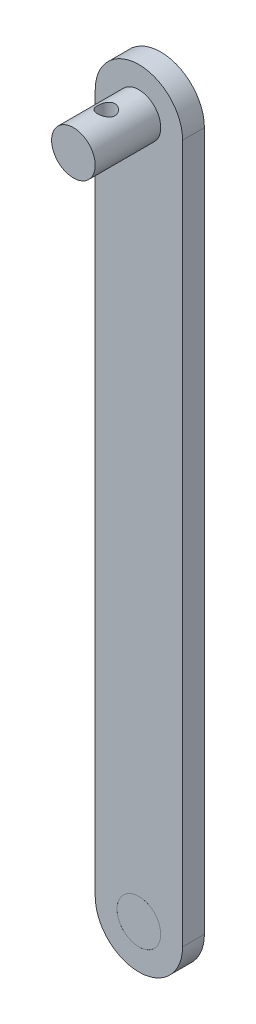
ISO-10303-21;
HEADER;
FILE_DESCRIPTION(('STEP AP214'),'2;1');
FILE_NAME('part.step','',(''),(''),'','','');
FILE_SCHEMA(('AUTOMOTIVE_DESIGN { 1 0 10303 214 1 1 1 1 }'));
ENDSEC;
DATA;
#1=APPLICATION_CONTEXT('core data for automotive mechanical design processes');
#2=APPLICATION_PROTOCOL_DEFINITION('international standard','automotive_design',2000,#1);
#3=PRODUCT_CONTEXT('',#1,'mechanical');
#4=PRODUCT('Part','Part','',(#3));
#5=PRODUCT_RELATED_PRODUCT_CATEGORY('part','',(#4));
#6=PRODUCT_DEFINITION_FORMATION('','',#4);
#7=PRODUCT_DEFINITION_CONTEXT('part definition',#1,'design');
#8=PRODUCT_DEFINITION('design','',#6,#7);
#9=PRODUCT_DEFINITION_SHAPE('','',#8);
#10=(LENGTH_UNIT() NAMED_UNIT(*) SI_UNIT(.MILLI.,.METRE.));
#11=(NAMED_UNIT(*) PLANE_ANGLE_UNIT() SI_UNIT($,.RADIAN.));
#12=(NAMED_UNIT(*) SI_UNIT($,.STERADIAN.) SOLID_ANGLE_UNIT());
#13=UNCERTAINTY_MEASURE_WITH_UNIT(LENGTH_MEASURE(1.E-05),#10,'distance_accuracy_value','');
#14=(GEOMETRIC_REPRESENTATION_CONTEXT(3) GLOBAL_UNCERTAINTY_ASSIGNED_CONTEXT((#13)) GLOBAL_UNIT_ASSIGNED_CONTEXT((#10,
#11,#12)) REPRESENTATION_CONTEXT('',''));
#15=CARTESIAN_POINT('',(0.,0.,0.));
#16=DIRECTION('',(0.,0.,1.));
#17=DIRECTION('',(1.,0.,0.));
#18=AXIS2_PLACEMENT_3D('',#15,#16,#17);
#19=CARTESIAN_POINT('',(0.,-101.6,-6.35));
#20=DIRECTION('',(0.,0.,1.));
#21=DIRECTION('',(1.,0.,0.));
#22=AXIS2_PLACEMENT_3D('',#19,#20,#21);
#23=CYLINDRICAL_SURFACE('',#22,6.35);
#24=CARTESIAN_POINT('',(0.,-101.6,-6.35));
#25=DIRECTION('',(0.,0.,1.));
#26=DIRECTION('',(1.,0.,0.));
#27=AXIS2_PLACEMENT_3D('',#24,#25,#26);
#28=CIRCLE('',#27,6.35);
#29=CARTESIAN_POINT('',(6.35,-101.6,-6.35));
#30=VERTEX_POINT('',#29);
#31=EDGE_CURVE('E11',#30,#30,#28,.T.);
#32=ORIENTED_EDGE('',*,*,#31,.T.);
#33=EDGE_LOOP('',(#32));
#34=FACE_BOUND('',#33,.T.);
#35=CARTESIAN_POINT('',(0.,-101.6,6.35));
#36=DIRECTION('',(0.,0.,1.));
#37=DIRECTION('',(1.,0.,0.));
#38=AXIS2_PLACEMENT_3D('',#35,#36,#37);
#39=CIRCLE('',#38,6.35);
#40=CARTESIAN_POINT('',(6.35,-101.6,6.35));
#41=VERTEX_POINT('',#40);
#42=EDGE_CURVE('E54',#41,#41,#39,.T.);
#43=ORIENTED_EDGE('',*,*,#42,.F.);
#44=EDGE_LOOP('',(#43));
#45=FACE_BOUND('',#44,.T.);
#46=ADVANCED_FACE('F51',(#34,#45),#23,.T.);
#47=CARTESIAN_POINT('',(0.,-101.6,-6.35));
#48=DIRECTION('',(0.,0.,1.));
#49=DIRECTION('',(1.,0.,0.));
#50=AXIS2_PLACEMENT_3D('',#47,#48,#49);
#51=PLANE('',#50);
#52=ORIENTED_EDGE('',*,*,#31,.F.);
#53=EDGE_LOOP('',(#52));
#54=FACE_BOUND('',#53,.T.);
#55=ADVANCED_FACE('F66',(#54),#51,.F.);
#56=CARTESIAN_POINT('',(0.,-101.6,6.35));
#57=DIRECTION('',(0.,0.,1.));
#58=DIRECTION('',(1.,0.,0.));
#59=AXIS2_PLACEMENT_3D('',#56,#57,#58);
#60=PLANE('',#59);
#61=ORIENTED_EDGE('',*,*,#42,.T.);
#62=EDGE_LOOP('',(#61));
#63=FACE_BOUND('',#62,.T.);
#64=ADVANCED_FACE('F63',(#63),#60,.T.);
#65=CLOSED_SHELL('',(#46,#55,#64));
#66=MANIFOLD_SOLID_BREP('B2',#65);
#67=CARTESIAN_POINT('',(0.,101.6,25.4));
#68=DIRECTION('',(0.,0.,-1.));
#69=DIRECTION('',(-1.,0.,0.));
#70=AXIS2_PLACEMENT_3D('',#67,#68,#69);
#71=CYLINDRICAL_SURFACE('',#70,6.35);
#72=CARTESIAN_POINT('',(0.,101.6,25.4));
#73=DIRECTION('',(0.,0.,1.));
#74=DIRECTION('',(1.,0.,0.));
#75=AXIS2_PLACEMENT_3D('',#72,#73,#74);
#76=CIRCLE('',#75,6.35);
#77=CARTESIAN_POINT('',(6.35,101.6,25.4));
#78=VERTEX_POINT('',#77);
#79=EDGE_CURVE('E223',#78,#78,#76,.T.);
#80=ORIENTED_EDGE('',*,*,#79,.F.);
#81=EDGE_LOOP('',(#80));
#82=FACE_BOUND('',#81,.T.);
#83=CARTESIAN_POINT('',(0.,101.6,6.35));
#84=DIRECTION('',(0.,0.,1.));
#85=DIRECTION('',(1.,0.,0.));
#86=AXIS2_PLACEMENT_3D('',#83,#84,#85);
#87=CIRCLE('',#86,6.35);
#88=CARTESIAN_POINT('',(6.35,101.6,6.35));
#89=VERTEX_POINT('',#88);
#90=EDGE_CURVE('E180',#89,#89,#87,.T.);
#91=ORIENTED_EDGE('',*,*,#90,.T.);
#92=EDGE_LOOP('',(#91));
#93=FACE_BOUND('',#92,.T.);
#94=CARTESIAN_POINT('',(0.,95.25,13.335));
#95=CARTESIAN_POINT('',(0.136524206735944,95.2500067537653,13.3350090967706));
#96=CARTESIAN_POINT('',(0.273271326569832,95.2544532912096,13.3460706290327));
#97=CARTESIAN_POINT('',(0.542918354048302,95.2718008185411,13.3899255020854));
#98=CARTESIAN_POINT('',(0.67580677525382,95.2847247905756,13.4227779202305));
#99=CARTESIAN_POINT('',(0.933392062216559,95.3176373635284,13.5088323741441));
#100=CARTESIAN_POINT('',(1.05811419595267,95.3376028200288,13.5619677889683));
#101=CARTESIAN_POINT('',(1.29676124667188,95.3826310910206,13.6868144158289));
#102=CARTESIAN_POINT('',(1.41068989295145,95.407692135432,13.7585191796974));
#103=CARTESIAN_POINT('',(1.63004632396242,95.4616977319217,13.9220390644513));
#104=CARTESIAN_POINT('',(1.7348990980416,95.4907628253185,14.0145854484005));
#105=CARTESIAN_POINT('',(1.92808224416796,95.5489506769739,14.2156180094426));
#106=CARTESIAN_POINT('',(2.01640453280471,95.5780734564433,14.3241119388329));
#107=CARTESIAN_POINT('',(2.17789070386169,95.6345205431251,14.5598236477725));
#108=CARTESIAN_POINT('',(2.25020502702758,95.6617071269639,14.6876598368656));
#109=CARTESIAN_POINT('',(2.37204849226828,95.7093126810088,14.9549312263771));
#110=CARTESIAN_POINT('',(2.42158845640477,95.7297348642726,15.094360880468));
#111=CARTESIAN_POINT('',(2.49415150594019,95.7602052576373,15.374254663566));
#112=CARTESIAN_POINT('',(2.51827533663395,95.770681961465,15.5143850691561));
#113=CARTESIAN_POINT('',(2.54275966122209,95.7813171485947,15.7970664478759));
#114=CARTESIAN_POINT('',(2.54313184070206,95.7814807058657,15.9396161961804));
#115=CARTESIAN_POINT('',(2.52093649674541,95.7718366464395,16.2125109727455));
#116=CARTESIAN_POINT('',(2.49996364917145,95.7627221770105,16.3430149572978));
#117=CARTESIAN_POINT('',(2.4383325379743,95.7367124173817,16.5984676361302));
#118=CARTESIAN_POINT('',(2.39767083940082,95.7198157695151,16.7234153569005));
#119=CARTESIAN_POINT('',(2.29704231034095,95.6797745393753,16.9672226519685));
#120=CARTESIAN_POINT('',(2.23669842514074,95.6565094831339,17.0859059335993));
#121=CARTESIAN_POINT('',(2.09868320512962,95.6063859218485,17.3118980867793));
#122=CARTESIAN_POINT('',(2.02100536247799,95.579526068698,17.4192026639416));
#123=CARTESIAN_POINT('',(1.84346926130722,95.5227104433731,17.6281203555785));
#124=CARTESIAN_POINT('',(1.74236057797273,95.4926758548029,17.7286522863964));
#125=CARTESIAN_POINT('',(1.52439932283632,95.4346602230298,17.9116792870626));
#126=CARTESIAN_POINT('',(1.40754362297472,95.4066795895444,17.9941707647111));
#127=CARTESIAN_POINT('',(1.15833861880942,95.3552235479402,18.1401941582181));
#128=CARTESIAN_POINT('',(1.02572882401002,95.3318480697882,18.2033192971203));
#129=CARTESIAN_POINT('',(0.750600182163255,95.2929916802248,18.3059931835691));
#130=CARTESIAN_POINT('',(0.608086409999082,95.2775067590277,18.3455539076979));
#131=CARTESIAN_POINT('',(0.326257777261934,95.2569070282622,18.397789335183));
#132=CARTESIAN_POINT('',(0.187252983361636,95.2512325879144,18.411917016902));
#133=CARTESIAN_POINT('',(-0.091243543455936,95.249130322915,18.4171756376713));
#134=CARTESIAN_POINT('',(-0.23073514079441,95.2527001015049,18.4083125375653));
#135=CARTESIAN_POINT('',(-0.499659578684899,95.2683188982903,18.368909474259));
#136=CARTESIAN_POINT('',(-0.62926276455476,95.2799797299119,18.3393613649543));
#137=CARTESIAN_POINT('',(-0.881551993637283,95.3102050941501,18.2607766504465));
#138=CARTESIAN_POINT('',(-1.0042371459859,95.3287705135721,18.2117375418208));
#139=CARTESIAN_POINT('',(-1.24343005798686,95.3717092464107,18.0939631266065));
#140=CARTESIAN_POINT('',(-1.35963408889802,95.3962428370565,18.0246712505051));
#141=CARTESIAN_POINT('',(-1.57917336088447,95.4484582677318,17.8689757886399));
#142=CARTESIAN_POINT('',(-1.68250341777165,95.4761413674995,17.7825653454885));
#143=CARTESIAN_POINT('',(-1.88051826464125,95.5339070059961,17.5883950835537));
#144=CARTESIAN_POINT('',(-1.97418189591311,95.5640272939023,17.4796024022862));
#145=CARTESIAN_POINT('',(-2.14217402073601,95.621580753952,17.2473110945791));
#146=CARTESIAN_POINT('',(-2.21649932797567,95.6490134828117,17.1238100495719));
#147=CARTESIAN_POINT('',(-2.34417552737538,95.6981283911737,16.8637436478619));
#148=CARTESIAN_POINT('',(-2.39731625476711,95.7197522877693,16.7270633209867));
#149=CARTESIAN_POINT('',(-2.47941619931716,95.7538893468242,16.4455682623354));
#150=CARTESIAN_POINT('',(-2.50839326377964,95.7664092326381,16.3007596186691));
#151=CARTESIAN_POINT('',(-2.53963883293423,95.7799486569121,16.0183475646992));
#152=CARTESIAN_POINT('',(-2.54367929088355,95.7817309532725,15.8809755535463));
#153=CARTESIAN_POINT('',(-2.52959001592309,95.7755915823034,15.6076080308743));
#154=CARTESIAN_POINT('',(-2.51146309820303,95.7676711471913,15.4716123467771));
#155=CARTESIAN_POINT('',(-2.45500062199855,95.743691556969,15.2103681182758));
#156=CARTESIAN_POINT('',(-2.41749256915668,95.7279666367898,15.0849072492419));
#157=CARTESIAN_POINT('',(-2.32410696727523,95.6903851833461,14.8420091426196));
#158=CARTESIAN_POINT('',(-2.26822434513928,95.6685269569613,14.7245741317449));
#159=CARTESIAN_POINT('',(-2.13597822075728,95.6195876619585,14.4937357747428));
#160=CARTESIAN_POINT('',(-2.05862525564912,95.5922792096984,14.3809482552866));
#161=CARTESIAN_POINT('',(-1.88708371169555,95.5362096693914,14.1693985208091));
#162=CARTESIAN_POINT('',(-1.79289005847571,95.5074481453894,14.0706405492603));
#163=CARTESIAN_POINT('',(-1.58305912509117,95.4494717580423,13.8833822423316));
#164=CARTESIAN_POINT('',(-1.46642749471675,95.4203484047761,13.7959621049299));
#165=CARTESIAN_POINT('',(-1.21908443861983,95.3668346037328,13.6419124714192));
#166=CARTESIAN_POINT('',(-1.08836650290568,95.3424463590016,13.5752926440916));
#167=CARTESIAN_POINT('',(-0.818776840744574,95.3015664698648,13.4662878940974));
#168=CARTESIAN_POINT('',(-0.680102293827397,95.2849362272416,13.4234747556515));
#169=CARTESIAN_POINT('',(-0.467940499282261,95.2668641339794,13.3774241417858));
#170=CARTESIAN_POINT('',(-0.396594153633359,95.2619869524348,13.3651050527703));
#171=CARTESIAN_POINT('',(-0.253000299869412,95.254637034718,13.3465988989027));
#172=CARTESIAN_POINT('',(-0.180753469322346,95.2521625895991,13.3404074756868));
#173=CARTESIAN_POINT('',(-0.0722838847024083,95.250307704843,13.3357700893125));
#174=CARTESIAN_POINT('',(-0.0361497567762078,95.2499982116946,13.3349975912986));
#175=CARTESIAN_POINT('',(0.,95.25,13.335));
#176=B_SPLINE_CURVE_WITH_KNOTS('',3,(#94,#95,#96,#97,#98,#99,#100,#101,#102,#103,#104,#105,#106,
#107,#108,#109,#110,#111,#112,#113,#114,#115,#116,#117,#118,#119,#120,#121,#122,#123,#124,#125,
#126,#127,#128,#129,#130,#131,#132,#133,#134,#135,#136,#137,#138,#139,#140,#141,#142,#143,#144,
#145,#146,#147,#148,#149,#150,#151,#152,#153,#154,#155,#156,#157,#158,#159,#160,#161,#162,#163,
#164,#165,#166,#167,#168,#169,#170,#171,#172,#173,#174,#175),.UNSPECIFIED.,.T.,.F.,(4,2,2,2,2,2,
2,2,2,2,2,2,2,2,2,2,2,2,2,2,2,2,2,2,2,2,2,2,2,2,2,2,2,2,2,2,2,2,2,2,4),(0.,0.4094517946242,
0.820018217730078,1.22924755098891,1.6383349703134,2.06498674759504,2.49184661566702,
2.93770378700405,3.383348873602,3.80878213742212,4.2340060905242,4.62963677069742,
5.0253364981518,5.42911190399497,5.83303915861493,6.26819103466927,6.7034294790646,
7.14726679716764,7.59087834264514,8.00822864350569,8.42547074834004,8.82396578566744,
9.22251202222121,9.63324862015793,10.0441500856369,10.48217962773,10.9202812968556,
11.3626270732885,11.8046458426034,12.2148558520879,12.6250137715507,13.0189518455694,
13.4129987747255,13.82960744432,14.2463418571246,14.6900953788797,15.1340548682348,
15.5697466228691,15.7872023626933,16.0045033235398,16.1129206008939),.UNSPECIFIED.);
#177=CARTESIAN_POINT('',(0.,95.25,13.335));
#178=VERTEX_POINT('',#177);
#179=EDGE_CURVE('E190',#178,#178,#176,.T.);
#180=ORIENTED_EDGE('',*,*,#179,.F.);
#181=EDGE_LOOP('',(#180));
#182=FACE_BOUND('',#181,.T.);
#183=CARTESIAN_POINT('',(0.,107.95,13.335));
#184=CARTESIAN_POINT('',(-0.136524206735944,107.949993246235,13.3350090967706));
#185=CARTESIAN_POINT('',(-0.273271326569831,107.94554670879,13.3460706290327));
#186=CARTESIAN_POINT('',(-0.542918354048302,107.928199181459,13.3899255020854));
#187=CARTESIAN_POINT('',(-0.675806775253819,107.915275209424,13.4227779202305));
#188=CARTESIAN_POINT('',(-0.933392062216559,107.882362636472,13.5088323741441));
#189=CARTESIAN_POINT('',(-1.05811419595267,107.862397179971,13.5619677889683));
#190=CARTESIAN_POINT('',(-1.29676124667188,107.817368908979,13.6868144158289));
#191=CARTESIAN_POINT('',(-1.41068989295145,107.792307864568,13.7585191796974));
#192=CARTESIAN_POINT('',(-1.63004632396242,107.738302268078,13.9220390644513));
#193=CARTESIAN_POINT('',(-1.7348990980416,107.709237174681,14.0145854484005));
#194=CARTESIAN_POINT('',(-1.92808224416796,107.651049323026,14.2156180094426));
#195=CARTESIAN_POINT('',(-2.01640453280471,107.621926543557,14.3241119388329));
#196=CARTESIAN_POINT('',(-2.17789070386169,107.565479456875,14.5598236477725));
#197=CARTESIAN_POINT('',(-2.25020502702758,107.538292873036,14.6876598368656));
#198=CARTESIAN_POINT('',(-2.37204849226828,107.490687318991,14.9549312263771));
#199=CARTESIAN_POINT('',(-2.42158845640477,107.470265135727,15.094360880468));
#200=CARTESIAN_POINT('',(-2.49415150594019,107.439794742363,15.374254663566));
#201=CARTESIAN_POINT('',(-2.51827533663395,107.429318038535,15.5143850691561));
#202=CARTESIAN_POINT('',(-2.54275966122209,107.418682851405,15.7970664478759));
#203=CARTESIAN_POINT('',(-2.54313184070206,107.418519294134,15.9396161961804));
#204=CARTESIAN_POINT('',(-2.52093649674541,107.42816335356,16.2125109727455));
#205=CARTESIAN_POINT('',(-2.49996364917145,107.43727782299,16.3430149572978));
#206=CARTESIAN_POINT('',(-2.4383325379743,107.463287582618,16.5984676361302));
#207=CARTESIAN_POINT('',(-2.39767083940082,107.480184230485,16.7234153569005));
#208=CARTESIAN_POINT('',(-2.29704231034095,107.520225460625,16.9672226519685));
#209=CARTESIAN_POINT('',(-2.23669842514074,107.543490516866,17.0859059335993));
#210=CARTESIAN_POINT('',(-2.09868320512962,107.593614078152,17.3118980867793));
#211=CARTESIAN_POINT('',(-2.02100536247799,107.620473931302,17.4192026639416));
#212=CARTESIAN_POINT('',(-1.84346926130722,107.677289556627,17.6281203555785));
#213=CARTESIAN_POINT('',(-1.74236057797273,107.707324145197,17.7286522863964));
#214=CARTESIAN_POINT('',(-1.52439932283632,107.76533977697,17.9116792870626));
#215=CARTESIAN_POINT('',(-1.40754362297472,107.793320410456,17.9941707647111));
#216=CARTESIAN_POINT('',(-1.15833861880943,107.84477645206,18.1401941582181));
#217=CARTESIAN_POINT('',(-1.02572882401003,107.868151930212,18.2033192971203));
#218=CARTESIAN_POINT('',(-0.750600182163258,107.907008319775,18.3059931835691));
#219=CARTESIAN_POINT('',(-0.608086409999084,107.922493240972,18.3455539076979));
#220=CARTESIAN_POINT('',(-0.326257777261934,107.943092971738,18.397789335183));
#221=CARTESIAN_POINT('',(-0.187252983361636,107.948767412086,18.411917016902));
#222=CARTESIAN_POINT('',(0.091243543455936,107.950869677085,18.4171756376713));
#223=CARTESIAN_POINT('',(0.23073514079441,107.947299898495,18.4083125375653));
#224=CARTESIAN_POINT('',(0.499659578684899,107.93168110171,18.368909474259));
#225=CARTESIAN_POINT('',(0.62926276455476,107.920020270088,18.3393613649543));
#226=CARTESIAN_POINT('',(0.881551993637283,107.88979490585,18.2607766504465));
#227=CARTESIAN_POINT('',(1.0042371459859,107.871229486428,18.2117375418208));
#228=CARTESIAN_POINT('',(1.24343005798685,107.828290753589,18.0939631266065));
#229=CARTESIAN_POINT('',(1.35963408889802,107.803757162943,18.0246712505051));
#230=CARTESIAN_POINT('',(1.57917336088446,107.751541732268,17.8689757886399));
#231=CARTESIAN_POINT('',(1.68250341777165,107.723858632501,17.7825653454885));
#232=CARTESIAN_POINT('',(1.88051826464125,107.666092994004,17.5883950835537));
#233=CARTESIAN_POINT('',(1.97418189591311,107.635972706098,17.4796024022862));
#234=CARTESIAN_POINT('',(2.14217402073601,107.578419246048,17.2473110945791));
#235=CARTESIAN_POINT('',(2.21649932797567,107.550986517188,17.1238100495719));
#236=CARTESIAN_POINT('',(2.34417552737538,107.501871608826,16.8637436478619));
#237=CARTESIAN_POINT('',(2.39731625476711,107.480247712231,16.7270633209867));
#238=CARTESIAN_POINT('',(2.47941619931716,107.446110653176,16.4455682623354));
#239=CARTESIAN_POINT('',(2.50839326377964,107.433590767362,16.3007596186691));
#240=CARTESIAN_POINT('',(2.53963883293423,107.420051343088,16.0183475646992));
#241=CARTESIAN_POINT('',(2.54367929088355,107.418269046728,15.8809755535463));
#242=CARTESIAN_POINT('',(2.52959001592309,107.424408417697,15.6076080308743));
#243=CARTESIAN_POINT('',(2.51146309820303,107.432328852809,15.4716123467771));
#244=CARTESIAN_POINT('',(2.45500062199855,107.456308443031,15.2103681182758));
#245=CARTESIAN_POINT('',(2.41749256915668,107.47203336321,15.0849072492419));
#246=CARTESIAN_POINT('',(2.32410696727523,107.509614816654,14.8420091426196));
#247=CARTESIAN_POINT('',(2.26822434513928,107.531473043039,14.7245741317449));
#248=CARTESIAN_POINT('',(2.13597822075728,107.580412338041,14.4937357747428));
#249=CARTESIAN_POINT('',(2.05862525564912,107.607720790302,14.3809482552866));
#250=CARTESIAN_POINT('',(1.88708371169555,107.663790330609,14.1693985208091));
#251=CARTESIAN_POINT('',(1.79289005847571,107.692551854611,14.0706405492603));
#252=CARTESIAN_POINT('',(1.58305912509117,107.750528241958,13.8833822423316));
#253=CARTESIAN_POINT('',(1.46642749471675,107.779651595224,13.7959621049299));
#254=CARTESIAN_POINT('',(1.21908443861983,107.833165396267,13.6419124714192));
#255=CARTESIAN_POINT('',(1.08836650290568,107.857553640998,13.5752926440916));
#256=CARTESIAN_POINT('',(0.818776840744574,107.898433530135,13.4662878940974));
#257=CARTESIAN_POINT('',(0.680102293827398,107.915063772758,13.4234747556515));
#258=CARTESIAN_POINT('',(0.467940499282261,107.933135866021,13.3774241417858));
#259=CARTESIAN_POINT('',(0.396594153633358,107.938013047565,13.3651050527703));
#260=CARTESIAN_POINT('',(0.253000299869411,107.945362965282,13.3465988989027));
#261=CARTESIAN_POINT('',(0.180753469322345,107.947837410401,13.3404074756868));
#262=CARTESIAN_POINT('',(0.0722838847024083,107.949692295157,13.3357700893125));
#263=CARTESIAN_POINT('',(0.0361497567762078,107.950001788305,13.3349975912986));
#264=CARTESIAN_POINT('',(0.,107.95,13.335));
#265=B_SPLINE_CURVE_WITH_KNOTS('',3,(#183,#184,#185,#186,#187,#188,#189,#190,#191,#192,#193,
#194,#195,#196,#197,#198,#199,#200,#201,#202,#203,#204,#205,#206,#207,#208,#209,#210,#211,#212,
#213,#214,#215,#216,#217,#218,#219,#220,#221,#222,#223,#224,#225,#226,#227,#228,#229,#230,#231,
#232,#233,#234,#235,#236,#237,#238,#239,#240,#241,#242,#243,#244,#245,#246,#247,#248,#249,#250,
#251,#252,#253,#254,#255,#256,#257,#258,#259,#260,#261,#262,#263,#264),.UNSPECIFIED.,.T.,.F.,(4,
2,2,2,2,2,2,2,2,2,2,2,2,2,2,2,2,2,2,2,2,2,2,2,2,2,2,2,2,2,2,2,2,2,2,2,2,2,2,2,4),(0.,
0.409451794624199,0.820018217730078,1.22924755098891,1.6383349703134,2.06498674759504,
2.49184661566702,2.93770378700405,3.383348873602,3.80878213742212,4.2340060905242,
4.62963677069742,5.0253364981518,5.42911190399497,5.83303915861493,6.26819103466927,
6.7034294790646,7.14726679716764,7.59087834264514,8.00822864350569,8.42547074834004,
8.82396578566744,9.22251202222121,9.63324862015792,10.0441500856369,10.48217962773,
10.9202812968556,11.3626270732885,11.8046458426034,12.2148558520879,12.6250137715507,
13.0189518455694,13.4129987747255,13.82960744432,14.2463418571246,14.6900953788797,
15.1340548682348,15.5697466228691,15.7872023626933,16.0045033235398,16.1129206008939),.UNSPECIFIED.);
#266=CARTESIAN_POINT('',(0.,107.95,13.335));
#267=VERTEX_POINT('',#266);
#268=EDGE_CURVE('E102',#267,#267,#265,.T.);
#269=ORIENTED_EDGE('',*,*,#268,.F.);
#270=EDGE_LOOP('',(#269));
#271=FACE_BOUND('',#270,.T.);
#272=ADVANCED_FACE('F98',(#82,#93,#182,#271),#71,.T.);
#273=CARTESIAN_POINT('',(0.,101.6,6.35));
#274=DIRECTION('',(0.,0.,-1.));
#275=DIRECTION('',(-1.,0.,0.));
#276=AXIS2_PLACEMENT_3D('',#273,#274,#275);
#277=PLANE('',#276);
#278=CARTESIAN_POINT('',(0.,101.6,6.35));
#279=DIRECTION('',(0.,0.,1.));
#280=DIRECTION('',(-1.,0.,0.));
#281=AXIS2_PLACEMENT_3D('',#278,#279,#280);
#282=CIRCLE('',#281,12.7);
#283=CARTESIAN_POINT('',(12.7,101.6,6.35));
#284=VERTEX_POINT('',#283);
#285=CARTESIAN_POINT('',(-12.7,101.6,6.35));
#286=VERTEX_POINT('',#285);
#287=EDGE_CURVE('E159',#284,#286,#282,.T.);
#288=ORIENTED_EDGE('',*,*,#287,.T.);
#289=DIRECTION('',(0.,-1.,0.));
#290=VECTOR('',#289,1.);
#291=CARTESIAN_POINT('',(-12.7,-101.6,6.35));
#292=LINE('',#291,#290);
#293=CARTESIAN_POINT('',(-12.7,-101.6,6.35));
#294=VERTEX_POINT('',#293);
#295=EDGE_CURVE('E153',#286,#294,#292,.T.);
#296=ORIENTED_EDGE('',*,*,#295,.T.);
#297=CARTESIAN_POINT('',(0.,-101.6,6.35));
#298=DIRECTION('',(0.,0.,1.));
#299=DIRECTION('',(1.,0.,0.));
#300=AXIS2_PLACEMENT_3D('',#297,#298,#299);
#301=CIRCLE('',#300,12.7);
#302=CARTESIAN_POINT('',(12.7,-101.6,6.35));
#303=VERTEX_POINT('',#302);
#304=EDGE_CURVE('E157',#294,#303,#301,.T.);
#305=ORIENTED_EDGE('',*,*,#304,.T.);
#306=DIRECTION('',(0.,1.,0.));
#307=VECTOR('',#306,1.);
#308=CARTESIAN_POINT('',(12.7,-101.6,6.35));
#309=LINE('',#308,#307);
#310=EDGE_CURVE('E123',#303,#284,#309,.T.);
#311=ORIENTED_EDGE('',*,*,#310,.T.);
#312=EDGE_LOOP('',(#288,#296,#305,#311));
#313=FACE_BOUND('',#312,.T.);
#314=ORIENTED_EDGE('',*,*,#90,.F.);
#315=EDGE_LOOP('',(#314));
#316=FACE_BOUND('',#315,.T.);
#317=CARTESIAN_POINT('',(0.,-101.6,6.35));
#318=DIRECTION('',(0.,0.,1.));
#319=DIRECTION('',(-1.,0.,0.));
#320=AXIS2_PLACEMENT_3D('',#317,#318,#319);
#321=CIRCLE('',#320,6.35);
#322=CARTESIAN_POINT('',(-6.35,-101.6,6.35));
#323=VERTEX_POINT('',#322);
#324=EDGE_CURVE('E238',#323,#323,#321,.T.);
#325=ORIENTED_EDGE('',*,*,#324,.F.);
#326=EDGE_LOOP('',(#325));
#327=FACE_BOUND('',#326,.T.);
#328=ADVANCED_FACE('F154',(#313,#316,#327),#277,.F.);
#329=CARTESIAN_POINT('',(0.,101.6,0.));
#330=DIRECTION('',(0.,0.,-1.));
#331=DIRECTION('',(-1.,0.,0.));
#332=AXIS2_PLACEMENT_3D('',#329,#330,#331);
#333=PLANE('',#332);
#334=CARTESIAN_POINT('',(0.,101.6,0.));
#335=DIRECTION('',(0.,0.,1.));
#336=DIRECTION('',(-1.,0.,0.));
#337=AXIS2_PLACEMENT_3D('',#334,#335,#336);
#338=CIRCLE('',#337,12.7);
#339=CARTESIAN_POINT('',(12.7,101.6,0.));
#340=VERTEX_POINT('',#339);
#341=CARTESIAN_POINT('',(-12.7,101.6,0.));
#342=VERTEX_POINT('',#341);
#343=EDGE_CURVE('E176',#340,#342,#338,.T.);
#344=ORIENTED_EDGE('',*,*,#343,.F.);
#345=DIRECTION('',(0.,1.,0.));
#346=VECTOR('',#345,1.);
#347=CARTESIAN_POINT('',(12.7,-101.6,0.));
#348=LINE('',#347,#346);
#349=CARTESIAN_POINT('',(12.7,-101.6,0.));
#350=VERTEX_POINT('',#349);
#351=EDGE_CURVE('E146',#350,#340,#348,.T.);
#352=ORIENTED_EDGE('',*,*,#351,.F.);
#353=CARTESIAN_POINT('',(0.,-101.6,0.));
#354=DIRECTION('',(0.,0.,1.));
#355=DIRECTION('',(1.,0.,0.));
#356=AXIS2_PLACEMENT_3D('',#353,#354,#355);
#357=CIRCLE('',#356,12.7);
#358=CARTESIAN_POINT('',(-12.7,-101.6,0.));
#359=VERTEX_POINT('',#358);
#360=EDGE_CURVE('E140',#359,#350,#357,.T.);
#361=ORIENTED_EDGE('',*,*,#360,.F.);
#362=DIRECTION('',(0.,-1.,0.));
#363=VECTOR('',#362,1.);
#364=CARTESIAN_POINT('',(-12.7,-101.6,0.));
#365=LINE('',#364,#363);
#366=EDGE_CURVE('E164',#342,#359,#365,.T.);
#367=ORIENTED_EDGE('',*,*,#366,.F.);
#368=EDGE_LOOP('',(#344,#352,#361,#367));
#369=FACE_BOUND('',#368,.T.);
#370=CARTESIAN_POINT('',(0.,-101.6,0.));
#371=DIRECTION('',(0.,0.,1.));
#372=DIRECTION('',(-1.,0.,0.));
#373=AXIS2_PLACEMENT_3D('',#370,#371,#372);
#374=CIRCLE('',#373,6.35);
#375=CARTESIAN_POINT('',(-6.35,-101.6,0.));
#376=VERTEX_POINT('',#375);
#377=EDGE_CURVE('E234',#376,#376,#374,.T.);
#378=ORIENTED_EDGE('',*,*,#377,.T.);
#379=EDGE_LOOP('',(#378));
#380=FACE_BOUND('',#379,.T.);
#381=ADVANCED_FACE('F219',(#369,#380),#333,.T.);
#382=CARTESIAN_POINT('',(0.,101.6,6.35));
#383=DIRECTION('',(0.,0.,-1.));
#384=DIRECTION('',(-1.,0.,0.));
#385=AXIS2_PLACEMENT_3D('',#382,#383,#384);
#386=CYLINDRICAL_SURFACE('',#385,12.7);
#387=ORIENTED_EDGE('',*,*,#343,.T.);
#388=DIRECTION('',(0.,0.,-1.));
#389=VECTOR('',#388,1.);
#390=CARTESIAN_POINT('',(-12.7,101.6,6.35));
#391=LINE('',#390,#389);
#392=EDGE_CURVE('E49',#286,#342,#391,.T.);
#393=ORIENTED_EDGE('',*,*,#392,.F.);
#394=ORIENTED_EDGE('',*,*,#287,.F.);
#395=DIRECTION('',(0.,0.,-1.));
#396=VECTOR('',#395,1.);
#397=CARTESIAN_POINT('',(12.7,101.6,6.35));
#398=LINE('',#397,#396);
#399=EDGE_CURVE('E172',#284,#340,#398,.T.);
#400=ORIENTED_EDGE('',*,*,#399,.T.);
#401=EDGE_LOOP('',(#387,#393,#394,#400));
#402=FACE_BOUND('',#401,.T.);
#403=ADVANCED_FACE('F100',(#402),#386,.T.);
#404=CARTESIAN_POINT('',(-12.7,-101.6,6.35));
#405=DIRECTION('',(1.,0.,0.));
#406=DIRECTION('',(0.,0.,-1.));
#407=AXIS2_PLACEMENT_3D('',#404,#405,#406);
#408=PLANE('',#407);
#409=ORIENTED_EDGE('',*,*,#366,.T.);
#410=DIRECTION('',(0.,0.,-1.));
#411=VECTOR('',#410,1.);
#412=CARTESIAN_POINT('',(-12.7,-101.6,6.35));
#413=LINE('',#412,#411);
#414=EDGE_CURVE('E114',#294,#359,#413,.T.);
#415=ORIENTED_EDGE('',*,*,#414,.F.);
#416=ORIENTED_EDGE('',*,*,#295,.F.);
#417=ORIENTED_EDGE('',*,*,#392,.T.);
#418=EDGE_LOOP('',(#409,#415,#416,#417));
#419=FACE_BOUND('',#418,.T.);
#420=ADVANCED_FACE('F163',(#419),#408,.F.);
#421=CARTESIAN_POINT('',(0.,-101.6,6.35));
#422=DIRECTION('',(0.,0.,-1.));
#423=DIRECTION('',(-1.,0.,0.));
#424=AXIS2_PLACEMENT_3D('',#421,#422,#423);
#425=CYLINDRICAL_SURFACE('',#424,12.7);
#426=ORIENTED_EDGE('',*,*,#360,.T.);
#427=DIRECTION('',(0.,0.,-1.));
#428=VECTOR('',#427,1.);
#429=CARTESIAN_POINT('',(12.7,-101.6,6.35));
#430=LINE('',#429,#428);
#431=EDGE_CURVE('E166',#303,#350,#430,.T.);
#432=ORIENTED_EDGE('',*,*,#431,.F.);
#433=ORIENTED_EDGE('',*,*,#304,.F.);
#434=ORIENTED_EDGE('',*,*,#414,.T.);
#435=EDGE_LOOP('',(#426,#432,#433,#434));
#436=FACE_BOUND('',#435,.T.);
#437=ADVANCED_FACE('F168',(#436),#425,.T.);
#438=CARTESIAN_POINT('',(12.7,-101.6,6.35));
#439=DIRECTION('',(-1.,0.,0.));
#440=DIRECTION('',(0.,0.,1.));
#441=AXIS2_PLACEMENT_3D('',#438,#439,#440);
#442=PLANE('',#441);
#443=ORIENTED_EDGE('',*,*,#351,.T.);
#444=ORIENTED_EDGE('',*,*,#399,.F.);
#445=ORIENTED_EDGE('',*,*,#310,.F.);
#446=ORIENTED_EDGE('',*,*,#431,.T.);
#447=EDGE_LOOP('',(#443,#444,#445,#446));
#448=FACE_BOUND('',#447,.T.);
#449=ADVANCED_FACE('F211',(#448),#442,.F.);
#450=CARTESIAN_POINT('',(0.,-101.6,6.35));
#451=DIRECTION('',(0.,0.,-1.));
#452=DIRECTION('',(-1.,0.,0.));
#453=AXIS2_PLACEMENT_3D('',#450,#451,#452);
#454=CYLINDRICAL_SURFACE('',#453,6.35);
#455=ORIENTED_EDGE('',*,*,#324,.T.);
#456=EDGE_LOOP('',(#455));
#457=FACE_BOUND('',#456,.T.);
#458=ORIENTED_EDGE('',*,*,#377,.F.);
#459=EDGE_LOOP('',(#458));
#460=FACE_BOUND('',#459,.T.);
#461=ADVANCED_FACE('F206',(#457,#460),#454,.F.);
#462=CARTESIAN_POINT('',(0.,101.6,25.4));
#463=DIRECTION('',(0.,0.,1.));
#464=DIRECTION('',(1.,0.,0.));
#465=AXIS2_PLACEMENT_3D('',#462,#463,#464);
#466=PLANE('',#465);
#467=ORIENTED_EDGE('',*,*,#79,.T.);
#468=EDGE_LOOP('',(#467));
#469=FACE_BOUND('',#468,.T.);
#470=ADVANCED_FACE('F202',(#469),#466,.T.);
#471=CARTESIAN_POINT('',(0.,114.3,15.875));
#472=DIRECTION('',(0.,-1.,0.));
#473=DIRECTION('',(0.,0.,-1.));
#474=AXIS2_PLACEMENT_3D('',#471,#472,#473);
#475=CYLINDRICAL_SURFACE('',#474,2.54);
#476=ORIENTED_EDGE('',*,*,#179,.T.);
#477=EDGE_LOOP('',(#476));
#478=FACE_BOUND('',#477,.T.);
#479=ORIENTED_EDGE('',*,*,#268,.T.);
#480=EDGE_LOOP('',(#479));
#481=FACE_BOUND('',#480,.T.);
#482=ADVANCED_FACE('F199',(#478,#481),#475,.F.);
#483=CLOSED_SHELL('',(#272,#328,#381,#403,#420,#437,#449,#461,#470,#482));
#484=MANIFOLD_SOLID_BREP('B6',#483);
#485=ADVANCED_BREP_SHAPE_REPRESENTATION('',(#18,#66,#484),#14);
#486=SHAPE_DEFINITION_REPRESENTATION(#9,#485);
ENDSEC;
END-ISO-10303-21;
